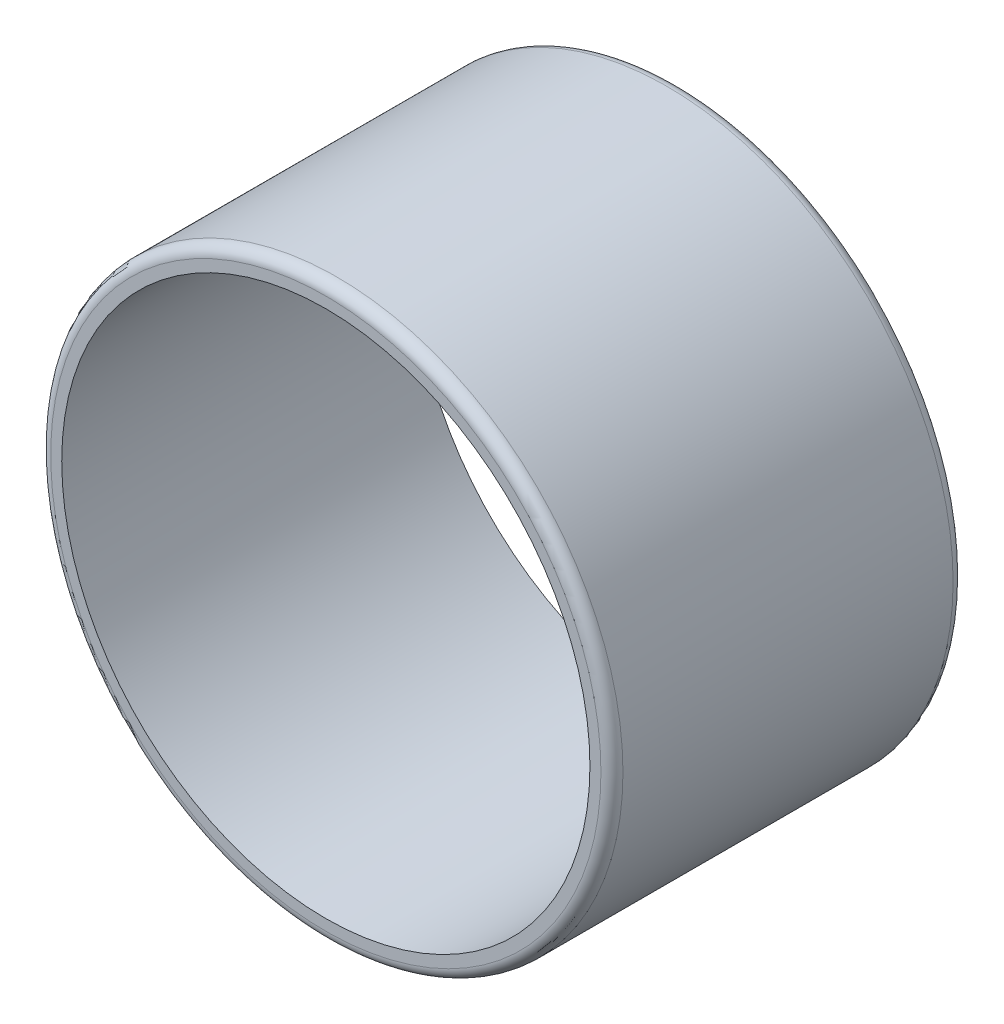
ISO-10303-21;
HEADER;
FILE_DESCRIPTION(('STEP AP214'),'2;1');
FILE_NAME('part.step','',(''),(''),'','','');
FILE_SCHEMA(('AUTOMOTIVE_DESIGN { 1 0 10303 214 1 1 1 1 }'));
ENDSEC;
DATA;
#1=APPLICATION_CONTEXT('core data for automotive mechanical design processes');
#2=APPLICATION_PROTOCOL_DEFINITION('international standard','automotive_design',2000,#1);
#3=PRODUCT_CONTEXT('',#1,'mechanical');
#4=PRODUCT('Part','Part','',(#3));
#5=PRODUCT_RELATED_PRODUCT_CATEGORY('part','',(#4));
#6=PRODUCT_DEFINITION_FORMATION('','',#4);
#7=PRODUCT_DEFINITION_CONTEXT('part definition',#1,'design');
#8=PRODUCT_DEFINITION('design','',#6,#7);
#9=PRODUCT_DEFINITION_SHAPE('','',#8);
#10=(LENGTH_UNIT() NAMED_UNIT(*) SI_UNIT(.MILLI.,.METRE.));
#11=(NAMED_UNIT(*) PLANE_ANGLE_UNIT() SI_UNIT($,.RADIAN.));
#12=(NAMED_UNIT(*) SI_UNIT($,.STERADIAN.) SOLID_ANGLE_UNIT());
#13=UNCERTAINTY_MEASURE_WITH_UNIT(LENGTH_MEASURE(1.E-05),#10,'distance_accuracy_value','');
#14=(GEOMETRIC_REPRESENTATION_CONTEXT(3) GLOBAL_UNCERTAINTY_ASSIGNED_CONTEXT((#13)) GLOBAL_UNIT_ASSIGNED_CONTEXT((#10,
#11,#12)) REPRESENTATION_CONTEXT('',''));
#15=CARTESIAN_POINT('',(0.,0.,0.));
#16=DIRECTION('',(0.,0.,1.));
#17=DIRECTION('',(1.,0.,0.));
#18=AXIS2_PLACEMENT_3D('',#15,#16,#17);
#19=CARTESIAN_POINT('',(0.,0.,8.));
#20=DIRECTION('',(0.,0.,1.));
#21=DIRECTION('',(1.,0.,0.));
#22=AXIS2_PLACEMENT_3D('',#19,#20,#21);
#23=PLANE('',#22);
#24=CARTESIAN_POINT('',(0.,0.,8.));
#25=DIRECTION('',(0.,0.,1.));
#26=DIRECTION('',(1.,0.,0.));
#27=AXIS2_PLACEMENT_3D('',#24,#25,#26);
#28=CIRCLE('',#27,12.5);
#29=CARTESIAN_POINT('',(12.5,0.,8.));
#30=VERTEX_POINT('',#29);
#31=EDGE_CURVE('E10',#30,#30,#28,.T.);
#32=ORIENTED_EDGE('',*,*,#31,.T.);
#33=EDGE_LOOP('',(#32));
#34=FACE_BOUND('',#33,.T.);
#35=CARTESIAN_POINT('',(0.,0.,8.));
#36=DIRECTION('',(0.,0.,1.));
#37=DIRECTION('',(1.,0.,0.));
#38=AXIS2_PLACEMENT_3D('',#35,#36,#37);
#39=CIRCLE('',#38,12.);
#40=CARTESIAN_POINT('',(12.,0.,8.));
#41=VERTEX_POINT('',#40);
#42=EDGE_CURVE('E51',#41,#41,#39,.T.);
#43=ORIENTED_EDGE('',*,*,#42,.F.);
#44=EDGE_LOOP('',(#43));
#45=FACE_BOUND('',#44,.T.);
#46=ADVANCED_FACE('F31',(#34,#45),#23,.T.);
#47=CARTESIAN_POINT('',(0.,0.,-8.));
#48=DIRECTION('',(0.,0.,1.));
#49=DIRECTION('',(1.,0.,0.));
#50=AXIS2_PLACEMENT_3D('',#47,#48,#49);
#51=PLANE('',#50);
#52=CARTESIAN_POINT('',(0.,0.,-8.));
#53=DIRECTION('',(0.,0.,1.));
#54=DIRECTION('',(1.,0.,0.));
#55=AXIS2_PLACEMENT_3D('',#52,#53,#54);
#56=CIRCLE('',#55,12.5);
#57=CARTESIAN_POINT('',(12.5,0.,-8.));
#58=VERTEX_POINT('',#57);
#59=EDGE_CURVE('E38',#58,#58,#56,.F.);
#60=ORIENTED_EDGE('',*,*,#59,.T.);
#61=EDGE_LOOP('',(#60));
#62=FACE_BOUND('',#61,.T.);
#63=CARTESIAN_POINT('',(0.,0.,-8.));
#64=DIRECTION('',(0.,0.,1.));
#65=DIRECTION('',(1.,0.,0.));
#66=AXIS2_PLACEMENT_3D('',#63,#64,#65);
#67=CIRCLE('',#66,12.);
#68=CARTESIAN_POINT('',(12.,0.,-8.));
#69=VERTEX_POINT('',#68);
#70=EDGE_CURVE('E54',#69,#69,#67,.T.);
#71=ORIENTED_EDGE('',*,*,#70,.T.);
#72=EDGE_LOOP('',(#71));
#73=FACE_BOUND('',#72,.T.);
#74=ADVANCED_FACE('F58',(#62,#73),#51,.F.);
#75=CARTESIAN_POINT('',(0.,0.,8.));
#76=DIRECTION('',(0.,0.,-1.));
#77=DIRECTION('',(-1.,0.,0.));
#78=AXIS2_PLACEMENT_3D('',#75,#76,#77);
#79=CYLINDRICAL_SURFACE('',#78,13.);
#80=CARTESIAN_POINT('',(0.,0.,-7.5));
#81=DIRECTION('',(0.,0.,1.));
#82=DIRECTION('',(1.,0.,0.));
#83=AXIS2_PLACEMENT_3D('',#80,#81,#82);
#84=CIRCLE('',#83,13.);
#85=CARTESIAN_POINT('',(13.,0.,-7.5));
#86=VERTEX_POINT('',#85);
#87=EDGE_CURVE('E42',#86,#86,#84,.T.);
#88=ORIENTED_EDGE('',*,*,#87,.T.);
#89=EDGE_LOOP('',(#88));
#90=FACE_BOUND('',#89,.T.);
#91=CARTESIAN_POINT('',(0.,0.,7.5));
#92=DIRECTION('',(0.,0.,1.));
#93=DIRECTION('',(1.,0.,0.));
#94=AXIS2_PLACEMENT_3D('',#91,#92,#93);
#95=CIRCLE('',#94,13.);
#96=CARTESIAN_POINT('',(13.,0.,7.5));
#97=VERTEX_POINT('',#96);
#98=EDGE_CURVE('E46',#97,#97,#95,.F.);
#99=ORIENTED_EDGE('',*,*,#98,.T.);
#100=EDGE_LOOP('',(#99));
#101=FACE_BOUND('',#100,.T.);
#102=ADVANCED_FACE('F33',(#90,#101),#79,.T.);
#103=CARTESIAN_POINT('',(0.,0.,8.));
#104=DIRECTION('',(0.,0.,-1.));
#105=DIRECTION('',(-1.,0.,0.));
#106=AXIS2_PLACEMENT_3D('',#103,#104,#105);
#107=CYLINDRICAL_SURFACE('',#106,12.);
#108=ORIENTED_EDGE('',*,*,#42,.T.);
#109=EDGE_LOOP('',(#108));
#110=FACE_BOUND('',#109,.T.);
#111=ORIENTED_EDGE('',*,*,#70,.F.);
#112=EDGE_LOOP('',(#111));
#113=FACE_BOUND('',#112,.T.);
#114=ADVANCED_FACE('F60',(#110,#113),#107,.F.);
#115=CARTESIAN_POINT('',(0.,0.,-7.5));
#116=DIRECTION('',(0.,0.,1.));
#117=DIRECTION('',(1.,0.,0.));
#118=AXIS2_PLACEMENT_3D('',#115,#116,#117);
#119=TOROIDAL_SURFACE('',#118,12.5,0.5);
#120=ORIENTED_EDGE('',*,*,#59,.F.);
#121=EDGE_LOOP('',(#120));
#122=FACE_BOUND('',#121,.T.);
#123=ORIENTED_EDGE('',*,*,#87,.F.);
#124=EDGE_LOOP('',(#123));
#125=FACE_BOUND('',#124,.T.);
#126=ADVANCED_FACE('F62',(#122,#125),#119,.T.);
#127=CARTESIAN_POINT('',(0.,0.,7.5));
#128=DIRECTION('',(0.,0.,1.));
#129=DIRECTION('',(1.,0.,0.));
#130=AXIS2_PLACEMENT_3D('',#127,#128,#129);
#131=TOROIDAL_SURFACE('',#130,12.5,0.5);
#132=ORIENTED_EDGE('',*,*,#98,.F.);
#133=EDGE_LOOP('',(#132));
#134=FACE_BOUND('',#133,.T.);
#135=ORIENTED_EDGE('',*,*,#31,.F.);
#136=EDGE_LOOP('',(#135));
#137=FACE_BOUND('',#136,.T.);
#138=ADVANCED_FACE('F69',(#134,#137),#131,.T.);
#139=CLOSED_SHELL('',(#46,#74,#102,#114,#126,#138));
#140=MANIFOLD_SOLID_BREP('B2',#139);
#141=ADVANCED_BREP_SHAPE_REPRESENTATION('',(#18,#140),#14);
#142=SHAPE_DEFINITION_REPRESENTATION(#9,#141);
ENDSEC;
END-ISO-10303-21;
